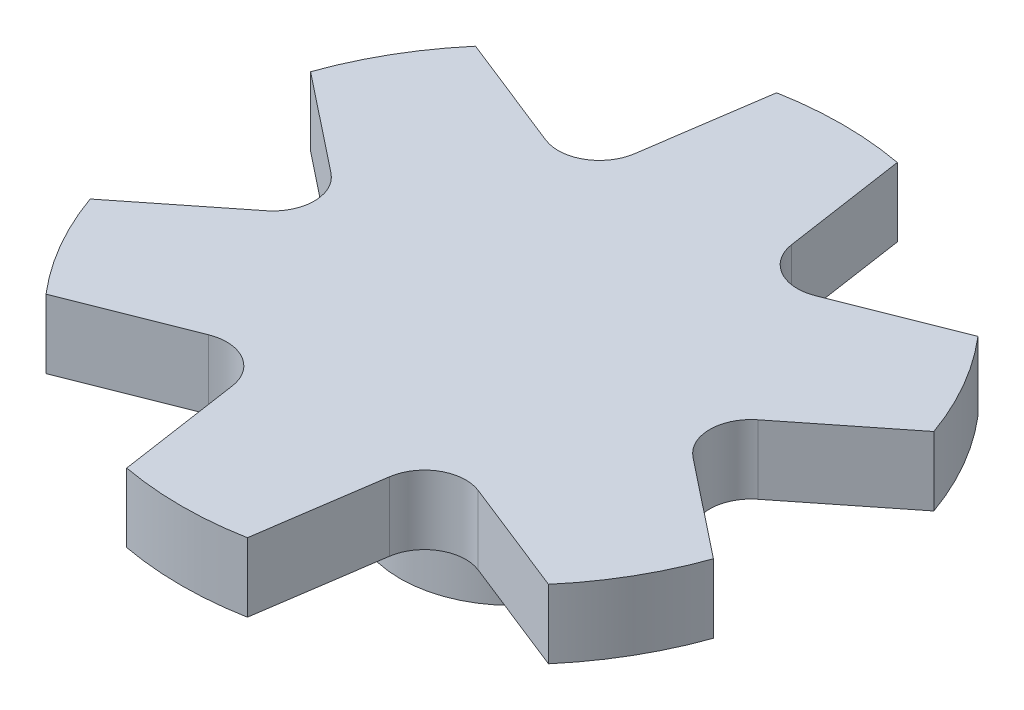
ISO-10303-21;
HEADER;
FILE_DESCRIPTION(('STEP AP214'),'2;1');
FILE_NAME('part.step','',(''),(''),'','','');
FILE_SCHEMA(('AUTOMOTIVE_DESIGN { 1 0 10303 214 1 1 1 1 }'));
ENDSEC;
DATA;
#1=APPLICATION_CONTEXT('core data for automotive mechanical design processes');
#2=APPLICATION_PROTOCOL_DEFINITION('international standard','automotive_design',2000,#1);
#3=PRODUCT_CONTEXT('',#1,'mechanical');
#4=PRODUCT('Part','Part','',(#3));
#5=PRODUCT_RELATED_PRODUCT_CATEGORY('part','',(#4));
#6=PRODUCT_DEFINITION_FORMATION('','',#4);
#7=PRODUCT_DEFINITION_CONTEXT('part definition',#1,'design');
#8=PRODUCT_DEFINITION('design','',#6,#7);
#9=PRODUCT_DEFINITION_SHAPE('','',#8);
#10=(LENGTH_UNIT() NAMED_UNIT(*) SI_UNIT(.MILLI.,.METRE.));
#11=(NAMED_UNIT(*) PLANE_ANGLE_UNIT() SI_UNIT($,.RADIAN.));
#12=(NAMED_UNIT(*) SI_UNIT($,.STERADIAN.) SOLID_ANGLE_UNIT());
#13=UNCERTAINTY_MEASURE_WITH_UNIT(LENGTH_MEASURE(1.E-05),#10,'distance_accuracy_value','');
#14=(GEOMETRIC_REPRESENTATION_CONTEXT(3) GLOBAL_UNCERTAINTY_ASSIGNED_CONTEXT((#13)) GLOBAL_UNIT_ASSIGNED_CONTEXT((#10,
#11,#12)) REPRESENTATION_CONTEXT('',''));
#15=CARTESIAN_POINT('',(0.,0.,0.));
#16=DIRECTION('',(0.,0.,1.));
#17=DIRECTION('',(1.,0.,0.));
#18=AXIS2_PLACEMENT_3D('',#15,#16,#17);
#19=CARTESIAN_POINT('',(-8.67923209555086,0.,4.57966997657877E-13));
#20=DIRECTION('',(0.,1.,0.));
#21=DIRECTION('',(0.,0.,1.));
#22=AXIS2_PLACEMENT_3D('',#19,#20,#21);
#23=PLANE('',#22);
#24=CARTESIAN_POINT('',(0.,0.,0.));
#25=DIRECTION('',(0.,1.,0.));
#26=DIRECTION('',(0.,0.,1.));
#27=AXIS2_PLACEMENT_3D('',#24,#25,#26);
#28=CIRCLE('',#27,4.064);
#29=CARTESIAN_POINT('',(0.,0.,4.064));
#30=VERTEX_POINT('',#29);
#31=EDGE_CURVE('E322',#30,#30,#28,.F.);
#32=ORIENTED_EDGE('',*,*,#31,.F.);
#33=EDGE_LOOP('',(#32));
#34=FACE_BOUND('',#33,.T.);
#35=CARTESIAN_POINT('',(0.,0.,0.));
#36=DIRECTION('',(0.,1.,0.));
#37=DIRECTION('',(0.,0.,1.));
#38=AXIS2_PLACEMENT_3D('',#35,#36,#37);
#39=CIRCLE('',#38,12.);
#40=CARTESIAN_POINT('',(9.1223260997724,0.,7.79635597759693));
#41=VERTEX_POINT('',#40);
#42=CARTESIAN_POINT('',(11.3130053834319,0.,4.00198815520987));
#43=VERTEX_POINT('',#42);
#44=EDGE_CURVE('E211',#41,#43,#39,.T.);
#45=ORIENTED_EDGE('',*,*,#44,.F.);
#46=DIRECTION('',(0.929806378211595,0.,0.368049044336534));
#47=VECTOR('',#46,1.);
#48=CARTESIAN_POINT('',(11.340123854113,0.,8.67423589232366));
#49=LINE('',#48,#47);
#50=CARTESIAN_POINT('',(4.89168961428061,0.,6.12172591277074));
#51=VERTEX_POINT('',#50);
#52=EDGE_CURVE('E209',#51,#41,#49,.T.);
#53=ORIENTED_EDGE('',*,*,#52,.F.);
#54=CARTESIAN_POINT('',(4.33961604777575,0.,7.51643548008819));
#55=DIRECTION('',(0.,-1.,0.));
#56=DIRECTION('',(0.,0.,1.));
#57=AXIS2_PLACEMENT_3D('',#54,#55,#56);
#58=CIRCLE('',#57,1.50000000000008);
#59=CARTESIAN_POINT('',(2.85572534832552,0.,7.29719042978003));
#60=VERTEX_POINT('',#59);
#61=EDGE_CURVE('E262',#60,#51,#58,.T.);
#62=ORIENTED_EDGE('',*,*,#61,.F.);
#63=DIRECTION('',(0.146163366871936,0.,-0.989260466300286));
#64=VECTOR('',#63,1.);
#65=CARTESIAN_POINT('',(1.84204671411442,0.,14.1579532858856));
#66=LINE('',#65,#64);
#67=CARTESIAN_POINT('',(2.19067928365965,0.,11.7983441328071));
#68=VERTEX_POINT('',#67);
#69=EDGE_CURVE('E260',#68,#60,#66,.T.);
#70=ORIENTED_EDGE('',*,*,#69,.F.);
#71=CARTESIAN_POINT('',(-2.19067928365932,0.,11.7983441328072));
#72=VERTEX_POINT('',#71);
#73=EDGE_CURVE('E373',#72,#68,#39,.T.);
#74=ORIENTED_EDGE('',*,*,#73,.F.);
#75=DIRECTION('',(0.146163366871806,0.,0.989260466300306));
#76=VECTOR('',#75,1.);
#77=CARTESIAN_POINT('',(-1.84204671411442,0.,14.1579532858856));
#78=LINE('',#77,#76);
#79=CARTESIAN_POINT('',(-2.85572534832447,0.,7.29719042978077));
#80=VERTEX_POINT('',#79);
#81=EDGE_CURVE('E257',#80,#72,#78,.T.);
#82=ORIENTED_EDGE('',*,*,#81,.F.);
#83=CARTESIAN_POINT('',(-4.33961604777496,0.,7.51643548008855));
#84=DIRECTION('',(0.,-1.,0.));
#85=DIRECTION('',(0.,0.,1.));
#86=AXIS2_PLACEMENT_3D('',#83,#84,#85);
#87=CIRCLE('',#86,1.50000000000004);
#88=CARTESIAN_POINT('',(-4.89168961427951,0.,6.121725912771));
#89=VERTEX_POINT('',#88);
#90=EDGE_CURVE('E255',#89,#80,#87,.T.);
#91=ORIENTED_EDGE('',*,*,#90,.F.);
#92=DIRECTION('',(0.929806378211645,0.,-0.368049044336407));
#93=VECTOR('',#92,1.);
#94=CARTESIAN_POINT('',(-11.340123854113,0.,8.67423589232362));
#95=LINE('',#94,#93);
#96=CARTESIAN_POINT('',(-9.12232609977221,0.,7.79635597759714));
#97=VERTEX_POINT('',#96);
#98=EDGE_CURVE('E253',#97,#89,#95,.T.);
#99=ORIENTED_EDGE('',*,*,#98,.F.);
#100=CARTESIAN_POINT('',(-11.3130053834318,0.,4.00198815521023));
#101=VERTEX_POINT('',#100);
#102=EDGE_CURVE('E378',#101,#97,#39,.T.);
#103=ORIENTED_EDGE('',*,*,#102,.F.);
#104=DIRECTION('',(-0.783643011339801,0.,0.621211421963802));
#105=VECTOR('',#104,1.);
#106=CARTESIAN_POINT('',(-13.1821705682276,0.,5.48371739356199));
#107=LINE('',#106,#105);
#108=CARTESIAN_POINT('',(-7.74741496260515,0.,1.17546451701015));
#109=VERTEX_POINT('',#108);
#110=EDGE_CURVE('E249',#109,#101,#107,.T.);
#111=ORIENTED_EDGE('',*,*,#110,.F.);
#112=CARTESIAN_POINT('',(-8.67923209555086,0.,4.57966997657877E-13));
#113=DIRECTION('',(0.,-1.,0.));
#114=DIRECTION('',(0.,0.,1.));
#115=AXIS2_PLACEMENT_3D('',#112,#113,#114);
#116=CIRCLE('',#115,1.5);
#117=CARTESIAN_POINT('',(-7.747414962605,0.,-1.17546451700912));
#118=VERTEX_POINT('',#117);
#119=EDGE_CURVE('E246',#118,#109,#116,.T.);
#120=ORIENTED_EDGE('',*,*,#119,.F.);
#121=DIRECTION('',(0.783643011339723,0.,0.621211421963901));
#122=VECTOR('',#121,1.);
#123=CARTESIAN_POINT('',(-13.1821705682275,0.,-5.48371739356212));
#124=LINE('',#123,#122);
#125=CARTESIAN_POINT('',(-11.3130053834319,0.,-4.00198815521009));
#126=VERTEX_POINT('',#125);
#127=EDGE_CURVE('E286',#126,#118,#124,.T.);
#128=ORIENTED_EDGE('',*,*,#127,.F.);
#129=CARTESIAN_POINT('',(-9.1223260997724,0.,-7.79635597759694));
#130=VERTEX_POINT('',#129);
#131=EDGE_CURVE('E365',#130,#126,#39,.T.);
#132=ORIENTED_EDGE('',*,*,#131,.F.);
#133=DIRECTION('',(-0.929806378211611,0.,-0.368049044336495));
#134=VECTOR('',#133,1.);
#135=CARTESIAN_POINT('',(-11.340123854113,0.,-8.67423589232358));
#136=LINE('',#135,#134);
#137=CARTESIAN_POINT('',(-4.89168961428064,0.,-6.12172591277078));
#138=VERTEX_POINT('',#137);
#139=EDGE_CURVE('E283',#138,#130,#136,.T.);
#140=ORIENTED_EDGE('',*,*,#139,.F.);
#141=CARTESIAN_POINT('',(-4.33961604777579,0.,-7.51643548008819));
#142=DIRECTION('',(0.,-1.,0.));
#143=DIRECTION('',(0.,0.,1.));
#144=AXIS2_PLACEMENT_3D('',#141,#142,#143);
#145=CIRCLE('',#144,1.50000000000002);
#146=CARTESIAN_POINT('',(-2.85572534832542,0.,-7.29719042978022));
#147=VERTEX_POINT('',#146);
#148=EDGE_CURVE('E281',#147,#138,#145,.T.);
#149=ORIENTED_EDGE('',*,*,#148,.F.);
#150=DIRECTION('',(-0.146163366871941,0.,0.989260466300286));
#151=VECTOR('',#150,1.);
#152=CARTESIAN_POINT('',(-1.84204671411432,0.,-14.1579532858856));
#153=LINE('',#152,#151);
#154=CARTESIAN_POINT('',(-2.19067928365956,0.,-11.7983441328072));
#155=VERTEX_POINT('',#154);
#156=EDGE_CURVE('E279',#155,#147,#153,.T.);
#157=ORIENTED_EDGE('',*,*,#156,.F.);
#158=CARTESIAN_POINT('',(2.19067928365941,0.,-11.7983441328072));
#159=VERTEX_POINT('',#158);
#160=EDGE_CURVE('E360',#159,#155,#39,.T.);
#161=ORIENTED_EDGE('',*,*,#160,.F.);
#162=DIRECTION('',(-0.146163366871801,0.,-0.989260466300306));
#163=VECTOR('',#162,1.);
#164=CARTESIAN_POINT('',(1.84204671411451,0.,-14.1579532858856));
#165=LINE('',#164,#163);
#166=CARTESIAN_POINT('',(2.85572534832459,0.,-7.297190429781));
#167=VERTEX_POINT('',#166);
#168=EDGE_CURVE('E276',#167,#159,#165,.T.);
#169=ORIENTED_EDGE('',*,*,#168,.F.);
#170=CARTESIAN_POINT('',(4.33961604777507,0.,-7.51643548008866));
#171=DIRECTION('',(0.,-1.,0.));
#172=DIRECTION('',(0.,0.,1.));
#173=AXIS2_PLACEMENT_3D('',#170,#171,#172);
#174=CIRCLE('',#173,1.50000000000001);
#175=CARTESIAN_POINT('',(4.89168961427954,0.,-6.12172591277121));
#176=VERTEX_POINT('',#175);
#177=EDGE_CURVE('E274',#176,#167,#174,.T.);
#178=ORIENTED_EDGE('',*,*,#177,.F.);
#179=DIRECTION('',(-0.929806378211664,0.,0.368049044336361));
#180=VECTOR('',#179,1.);
#181=CARTESIAN_POINT('',(11.3401238541132,0.,-8.67423589232349));
#182=LINE('',#181,#180);
#183=CARTESIAN_POINT('',(9.12232609977225,0.,-7.79635597759711));
#184=VERTEX_POINT('',#183);
#185=EDGE_CURVE('E272',#184,#176,#182,.T.);
#186=ORIENTED_EDGE('',*,*,#185,.F.);
#187=CARTESIAN_POINT('',(11.3130053834318,0.,-4.00198815521022));
#188=VERTEX_POINT('',#187);
#189=EDGE_CURVE('E362',#188,#184,#39,.T.);
#190=ORIENTED_EDGE('',*,*,#189,.F.);
#191=DIRECTION('',(0.783643011339806,0.,-0.621211421963796));
#192=VECTOR('',#191,1.);
#193=CARTESIAN_POINT('',(13.1821705682275,0.,-5.48371739356193));
#194=LINE('',#193,#192);
#195=CARTESIAN_POINT('',(7.74741496260534,0.,-1.17546451701017));
#196=VERTEX_POINT('',#195);
#197=EDGE_CURVE('E269',#196,#188,#194,.T.);
#198=ORIENTED_EDGE('',*,*,#197,.F.);
#199=CARTESIAN_POINT('',(8.67923209555104,0.,-4.3269875418577E-13));
#200=DIRECTION('',(0.,-1.,0.));
#201=DIRECTION('',(0.,0.,1.));
#202=AXIS2_PLACEMENT_3D('',#199,#200,#201);
#203=CIRCLE('',#202,1.50000000000003);
#204=CARTESIAN_POINT('',(7.74741496260504,0.,1.17546451700891));
#205=VERTEX_POINT('',#204);
#206=EDGE_CURVE('E267',#205,#196,#203,.T.);
#207=ORIENTED_EDGE('',*,*,#206,.F.);
#208=DIRECTION('',(-0.783643011339728,0.,-0.621211421963894));
#209=VECTOR('',#208,1.);
#210=CARTESIAN_POINT('',(13.1821705682275,0.,5.48371739356183));
#211=LINE('',#210,#209);
#212=EDGE_CURVE('E265',#43,#205,#211,.T.);
#213=ORIENTED_EDGE('',*,*,#212,.F.);
#214=EDGE_LOOP('',(#45,#53,#62,#70,#74,#82,#91,#99,#103,#111,#120,#128,#132,#140,#149,#157,#161,
#169,#178,#186,#190,#198,#207,#213));
#215=FACE_BOUND('',#214,.T.);
#216=ADVANCED_FACE('F33',(#34,#215),#23,.F.);
#217=CARTESIAN_POINT('',(-13.1821705682276,2.5,5.48371739356199));
#218=DIRECTION('',(0.621211421963802,0.,0.783643011339801));
#219=DIRECTION('',(0.783643011339801,0.,-0.621211421963802));
#220=AXIS2_PLACEMENT_3D('',#217,#218,#219);
#221=PLANE('',#220);
#222=DIRECTION('',(0.,1.,0.));
#223=VECTOR('',#222,1.);
#224=CARTESIAN_POINT('',(-11.3130053834318,-3.75,4.00198815521023));
#225=LINE('',#224,#223);
#226=CARTESIAN_POINT('',(-11.3130053834318,2.5,4.00198815521023));
#227=VERTEX_POINT('',#226);
#228=EDGE_CURVE('E379',#227,#101,#225,.F.);
#229=ORIENTED_EDGE('',*,*,#228,.F.);
#230=DIRECTION('',(-0.783643011339801,0.,0.621211421963802));
#231=VECTOR('',#230,1.);
#232=CARTESIAN_POINT('',(-13.1821705682276,2.5,5.48371739356199));
#233=LINE('',#232,#231);
#234=CARTESIAN_POINT('',(-7.74741496260515,2.5,1.17546451701015));
#235=VERTEX_POINT('',#234);
#236=EDGE_CURVE('E391',#235,#227,#233,.T.);
#237=ORIENTED_EDGE('',*,*,#236,.F.);
#238=DIRECTION('',(0.,-1.,0.));
#239=VECTOR('',#238,1.);
#240=CARTESIAN_POINT('',(-7.74741496260515,2.5,1.17546451701015));
#241=LINE('',#240,#239);
#242=EDGE_CURVE('E320',#235,#109,#241,.T.);
#243=ORIENTED_EDGE('',*,*,#242,.T.);
#244=ORIENTED_EDGE('',*,*,#110,.T.);
#245=EDGE_LOOP('',(#229,#237,#243,#244));
#246=FACE_BOUND('',#245,.T.);
#247=ADVANCED_FACE('F445',(#246),#221,.F.);
#248=CARTESIAN_POINT('',(-11.340123854113,2.5,8.67423589232362));
#249=DIRECTION('',(-0.368049044336407,0.,-0.929806378211645));
#250=DIRECTION('',(-0.929806378211645,0.,0.368049044336407));
#251=AXIS2_PLACEMENT_3D('',#248,#249,#250);
#252=PLANE('',#251);
#253=DIRECTION('',(0.,1.,0.));
#254=VECTOR('',#253,1.);
#255=CARTESIAN_POINT('',(-9.12232609977221,-3.75,7.79635597759714));
#256=LINE('',#255,#254);
#257=CARTESIAN_POINT('',(-9.12232609977221,2.5,7.79635597759714));
#258=VERTEX_POINT('',#257);
#259=EDGE_CURVE('E376',#97,#258,#256,.T.);
#260=ORIENTED_EDGE('',*,*,#259,.F.);
#261=ORIENTED_EDGE('',*,*,#98,.T.);
#262=DIRECTION('',(0.,-1.,0.));
#263=VECTOR('',#262,1.);
#264=CARTESIAN_POINT('',(-4.89168961427951,2.5,6.121725912771));
#265=LINE('',#264,#263);
#266=CARTESIAN_POINT('',(-4.89168961427951,2.5,6.121725912771));
#267=VERTEX_POINT('',#266);
#268=EDGE_CURVE('E317',#267,#89,#265,.T.);
#269=ORIENTED_EDGE('',*,*,#268,.F.);
#270=DIRECTION('',(0.929806378211645,0.,-0.368049044336407));
#271=VECTOR('',#270,1.);
#272=CARTESIAN_POINT('',(-11.340123854113,2.5,8.67423589232362));
#273=LINE('',#272,#271);
#274=EDGE_CURVE('E393',#258,#267,#273,.T.);
#275=ORIENTED_EDGE('',*,*,#274,.F.);
#276=EDGE_LOOP('',(#260,#261,#269,#275));
#277=FACE_BOUND('',#276,.T.);
#278=ADVANCED_FACE('F453',(#277),#252,.F.);
#279=CARTESIAN_POINT('',(-1.84204671411442,2.5,14.1579532858856));
#280=DIRECTION('',(0.989260466300306,0.,-0.146163366871806));
#281=DIRECTION('',(-0.146163366871806,0.,-0.989260466300306));
#282=AXIS2_PLACEMENT_3D('',#279,#280,#281);
#283=PLANE('',#282);
#284=DIRECTION('',(0.,1.,0.));
#285=VECTOR('',#284,1.);
#286=CARTESIAN_POINT('',(-2.19067928365932,-3.75,11.7983441328072));
#287=LINE('',#286,#285);
#288=CARTESIAN_POINT('',(-2.19067928365932,2.5,11.7983441328072));
#289=VERTEX_POINT('',#288);
#290=EDGE_CURVE('E374',#289,#72,#287,.F.);
#291=ORIENTED_EDGE('',*,*,#290,.F.);
#292=DIRECTION('',(0.146163366871806,0.,0.989260466300306));
#293=VECTOR('',#292,1.);
#294=CARTESIAN_POINT('',(-1.84204671411442,2.5,14.1579532858856));
#295=LINE('',#294,#293);
#296=CARTESIAN_POINT('',(-2.85572534832447,2.5,7.29719042978077));
#297=VERTEX_POINT('',#296);
#298=EDGE_CURVE('E397',#297,#289,#295,.T.);
#299=ORIENTED_EDGE('',*,*,#298,.F.);
#300=DIRECTION('',(0.,-1.,0.));
#301=VECTOR('',#300,1.);
#302=CARTESIAN_POINT('',(-2.85572534832447,2.5,7.29719042978077));
#303=LINE('',#302,#301);
#304=EDGE_CURVE('E314',#297,#80,#303,.T.);
#305=ORIENTED_EDGE('',*,*,#304,.T.);
#306=ORIENTED_EDGE('',*,*,#81,.T.);
#307=EDGE_LOOP('',(#291,#299,#305,#306));
#308=FACE_BOUND('',#307,.T.);
#309=ADVANCED_FACE('F519',(#308),#283,.F.);
#310=CARTESIAN_POINT('',(1.84204671411442,2.5,14.1579532858856));
#311=DIRECTION('',(-0.989260466300286,0.,-0.146163366871936));
#312=DIRECTION('',(-0.146163366871936,0.,0.989260466300286));
#313=AXIS2_PLACEMENT_3D('',#310,#311,#312);
#314=PLANE('',#313);
#315=DIRECTION('',(0.,1.,0.));
#316=VECTOR('',#315,1.);
#317=CARTESIAN_POINT('',(2.19067928365965,-3.75,11.7983441328071));
#318=LINE('',#317,#316);
#319=CARTESIAN_POINT('',(2.19067928365965,2.5,11.7983441328071));
#320=VERTEX_POINT('',#319);
#321=EDGE_CURVE('E210',#68,#320,#318,.T.);
#322=ORIENTED_EDGE('',*,*,#321,.F.);
#323=ORIENTED_EDGE('',*,*,#69,.T.);
#324=DIRECTION('',(0.,-1.,0.));
#325=VECTOR('',#324,1.);
#326=CARTESIAN_POINT('',(2.85572534832552,2.5,7.29719042978003));
#327=LINE('',#326,#325);
#328=CARTESIAN_POINT('',(2.85572534832552,2.5,7.29719042978003));
#329=VERTEX_POINT('',#328);
#330=EDGE_CURVE('E311',#329,#60,#327,.T.);
#331=ORIENTED_EDGE('',*,*,#330,.F.);
#332=DIRECTION('',(0.146163366871936,0.,-0.989260466300286));
#333=VECTOR('',#332,1.);
#334=CARTESIAN_POINT('',(1.84204671411442,2.5,14.1579532858856));
#335=LINE('',#334,#333);
#336=EDGE_CURVE('E221',#320,#329,#335,.T.);
#337=ORIENTED_EDGE('',*,*,#336,.F.);
#338=EDGE_LOOP('',(#322,#323,#331,#337));
#339=FACE_BOUND('',#338,.T.);
#340=ADVANCED_FACE('F401',(#339),#314,.F.);
#341=CARTESIAN_POINT('',(11.340123854113,2.5,8.67423589232366));
#342=DIRECTION('',(0.368049044336534,0.,-0.929806378211595));
#343=DIRECTION('',(-0.929806378211595,0.,-0.368049044336534));
#344=AXIS2_PLACEMENT_3D('',#341,#342,#343);
#345=PLANE('',#344);
#346=DIRECTION('',(0.,1.,0.));
#347=VECTOR('',#346,1.);
#348=CARTESIAN_POINT('',(9.1223260997724,-3.75,7.79635597759693));
#349=LINE('',#348,#347);
#350=CARTESIAN_POINT('',(9.12232609977239,2.5,7.79635597759693));
#351=VERTEX_POINT('',#350);
#352=EDGE_CURVE('E195',#351,#41,#349,.F.);
#353=ORIENTED_EDGE('',*,*,#352,.F.);
#354=DIRECTION('',(0.929806378211595,0.,0.368049044336534));
#355=VECTOR('',#354,1.);
#356=CARTESIAN_POINT('',(11.340123854113,2.5,8.67423589232366));
#357=LINE('',#356,#355);
#358=CARTESIAN_POINT('',(4.89168961428061,2.5,6.12172591277074));
#359=VERTEX_POINT('',#358);
#360=EDGE_CURVE('E207',#359,#351,#357,.T.);
#361=ORIENTED_EDGE('',*,*,#360,.F.);
#362=DIRECTION('',(0.,-1.,0.));
#363=VECTOR('',#362,1.);
#364=CARTESIAN_POINT('',(4.89168961428061,2.5,6.12172591277074));
#365=LINE('',#364,#363);
#366=EDGE_CURVE('E309',#359,#51,#365,.T.);
#367=ORIENTED_EDGE('',*,*,#366,.T.);
#368=ORIENTED_EDGE('',*,*,#52,.T.);
#369=EDGE_LOOP('',(#353,#361,#367,#368));
#370=FACE_BOUND('',#369,.T.);
#371=ADVANCED_FACE('F205',(#370),#345,.F.);
#372=CARTESIAN_POINT('',(13.1821705682275,2.5,5.48371739356183));
#373=DIRECTION('',(-0.621211421963894,0.,0.783643011339728));
#374=DIRECTION('',(0.783643011339728,0.,0.621211421963894));
#375=AXIS2_PLACEMENT_3D('',#372,#373,#374);
#376=PLANE('',#375);
#377=DIRECTION('',(0.,1.,0.));
#378=VECTOR('',#377,1.);
#379=CARTESIAN_POINT('',(11.3130053834319,-3.75,4.00198815520987));
#380=LINE('',#379,#378);
#381=CARTESIAN_POINT('',(11.3130053834319,2.5,4.00198815520986));
#382=VERTEX_POINT('',#381);
#383=EDGE_CURVE('E198',#43,#382,#380,.T.);
#384=ORIENTED_EDGE('',*,*,#383,.F.);
#385=ORIENTED_EDGE('',*,*,#212,.T.);
#386=DIRECTION('',(0.,-1.,0.));
#387=VECTOR('',#386,1.);
#388=CARTESIAN_POINT('',(7.74741496260504,2.5,1.17546451700891));
#389=LINE('',#388,#387);
#390=CARTESIAN_POINT('',(7.74741496260504,2.5,1.17546451700891));
#391=VERTEX_POINT('',#390);
#392=EDGE_CURVE('E306',#391,#205,#389,.T.);
#393=ORIENTED_EDGE('',*,*,#392,.F.);
#394=DIRECTION('',(-0.783643011339728,0.,-0.621211421963894));
#395=VECTOR('',#394,1.);
#396=CARTESIAN_POINT('',(13.1821705682275,2.5,5.48371739356183));
#397=LINE('',#396,#395);
#398=EDGE_CURVE('E217',#382,#391,#397,.T.);
#399=ORIENTED_EDGE('',*,*,#398,.F.);
#400=EDGE_LOOP('',(#384,#385,#393,#399));
#401=FACE_BOUND('',#400,.T.);
#402=ADVANCED_FACE('F507',(#401),#376,.F.);
#403=CARTESIAN_POINT('',(13.1821705682275,2.5,-5.48371739356193));
#404=DIRECTION('',(-0.621211421963796,0.,-0.783643011339806));
#405=DIRECTION('',(-0.783643011339806,0.,0.621211421963796));
#406=AXIS2_PLACEMENT_3D('',#403,#404,#405);
#407=PLANE('',#406);
#408=DIRECTION('',(0.,1.,0.));
#409=VECTOR('',#408,1.);
#410=CARTESIAN_POINT('',(11.3130053834318,-3.75,-4.00198815521022));
#411=LINE('',#410,#409);
#412=CARTESIAN_POINT('',(11.3130053834318,2.5,-4.00198815521022));
#413=VERTEX_POINT('',#412);
#414=EDGE_CURVE('E369',#413,#188,#411,.F.);
#415=ORIENTED_EDGE('',*,*,#414,.F.);
#416=DIRECTION('',(0.783643011339806,0.,-0.621211421963796));
#417=VECTOR('',#416,1.);
#418=CARTESIAN_POINT('',(13.1821705682275,2.5,-5.48371739356193));
#419=LINE('',#418,#417);
#420=CARTESIAN_POINT('',(7.74741496260534,2.5,-1.17546451701017));
#421=VERTEX_POINT('',#420);
#422=EDGE_CURVE('E226',#421,#413,#419,.T.);
#423=ORIENTED_EDGE('',*,*,#422,.F.);
#424=DIRECTION('',(0.,-1.,0.));
#425=VECTOR('',#424,1.);
#426=CARTESIAN_POINT('',(7.74741496260534,2.5,-1.17546451701017));
#427=LINE('',#426,#425);
#428=EDGE_CURVE('E303',#421,#196,#427,.T.);
#429=ORIENTED_EDGE('',*,*,#428,.T.);
#430=ORIENTED_EDGE('',*,*,#197,.T.);
#431=EDGE_LOOP('',(#415,#423,#429,#430));
#432=FACE_BOUND('',#431,.T.);
#433=ADVANCED_FACE('F505',(#432),#407,.F.);
#434=CARTESIAN_POINT('',(11.3401238541132,2.5,-8.67423589232349));
#435=DIRECTION('',(0.368049044336361,0.,0.929806378211664));
#436=DIRECTION('',(0.929806378211664,0.,-0.368049044336361));
#437=AXIS2_PLACEMENT_3D('',#434,#435,#436);
#438=PLANE('',#437);
#439=DIRECTION('',(0.,1.,0.));
#440=VECTOR('',#439,1.);
#441=CARTESIAN_POINT('',(9.12232609977225,-3.75,-7.79635597759711));
#442=LINE('',#441,#440);
#443=CARTESIAN_POINT('',(9.12232609977225,2.5,-7.79635597759711));
#444=VERTEX_POINT('',#443);
#445=EDGE_CURVE('E346',#184,#444,#442,.T.);
#446=ORIENTED_EDGE('',*,*,#445,.F.);
#447=ORIENTED_EDGE('',*,*,#185,.T.);
#448=DIRECTION('',(0.,-1.,0.));
#449=VECTOR('',#448,1.);
#450=CARTESIAN_POINT('',(4.89168961427954,2.5,-6.12172591277121));
#451=LINE('',#450,#449);
#452=CARTESIAN_POINT('',(4.89168961427954,2.5,-6.12172591277121));
#453=VERTEX_POINT('',#452);
#454=EDGE_CURVE('E300',#453,#176,#451,.T.);
#455=ORIENTED_EDGE('',*,*,#454,.F.);
#456=DIRECTION('',(-0.929806378211664,0.,0.368049044336361));
#457=VECTOR('',#456,1.);
#458=CARTESIAN_POINT('',(11.3401238541132,2.5,-8.67423589232349));
#459=LINE('',#458,#457);
#460=EDGE_CURVE('E229',#444,#453,#459,.T.);
#461=ORIENTED_EDGE('',*,*,#460,.F.);
#462=EDGE_LOOP('',(#446,#447,#455,#461));
#463=FACE_BOUND('',#462,.T.);
#464=ADVANCED_FACE('F345',(#463),#438,.F.);
#465=CARTESIAN_POINT('',(1.84204671411451,2.5,-14.1579532858856));
#466=DIRECTION('',(-0.989260466300306,0.,0.146163366871801));
#467=DIRECTION('',(0.146163366871801,0.,0.989260466300306));
#468=AXIS2_PLACEMENT_3D('',#465,#466,#467);
#469=PLANE('',#468);
#470=DIRECTION('',(0.,1.,0.));
#471=VECTOR('',#470,1.);
#472=CARTESIAN_POINT('',(2.19067928365941,-3.75,-11.7983441328072));
#473=LINE('',#472,#471);
#474=CARTESIAN_POINT('',(2.19067928365941,2.5,-11.7983441328072));
#475=VERTEX_POINT('',#474);
#476=EDGE_CURVE('E358',#475,#159,#473,.F.);
#477=ORIENTED_EDGE('',*,*,#476,.F.);
#478=DIRECTION('',(-0.146163366871801,0.,-0.989260466300306));
#479=VECTOR('',#478,1.);
#480=CARTESIAN_POINT('',(1.84204671411451,2.5,-14.1579532858856));
#481=LINE('',#480,#479);
#482=CARTESIAN_POINT('',(2.85572534832459,2.5,-7.297190429781));
#483=VERTEX_POINT('',#482);
#484=EDGE_CURVE('E233',#483,#475,#481,.T.);
#485=ORIENTED_EDGE('',*,*,#484,.F.);
#486=DIRECTION('',(0.,-1.,0.));
#487=VECTOR('',#486,1.);
#488=CARTESIAN_POINT('',(2.85572534832459,2.5,-7.297190429781));
#489=LINE('',#488,#487);
#490=EDGE_CURVE('E297',#483,#167,#489,.T.);
#491=ORIENTED_EDGE('',*,*,#490,.T.);
#492=ORIENTED_EDGE('',*,*,#168,.T.);
#493=EDGE_LOOP('',(#477,#485,#491,#492));
#494=FACE_BOUND('',#493,.T.);
#495=ADVANCED_FACE('F356',(#494),#469,.F.);
#496=CARTESIAN_POINT('',(-1.84204671411432,2.5,-14.1579532858856));
#497=DIRECTION('',(0.989260466300286,0.,0.146163366871941));
#498=DIRECTION('',(0.146163366871941,0.,-0.989260466300286));
#499=AXIS2_PLACEMENT_3D('',#496,#497,#498);
#500=PLANE('',#499);
#501=DIRECTION('',(0.,1.,0.));
#502=VECTOR('',#501,1.);
#503=CARTESIAN_POINT('',(-2.19067928365956,-3.75,-11.7983441328072));
#504=LINE('',#503,#502);
#505=CARTESIAN_POINT('',(-2.19067928365956,2.5,-11.7983441328072));
#506=VERTEX_POINT('',#505);
#507=EDGE_CURVE('E57',#155,#506,#504,.T.);
#508=ORIENTED_EDGE('',*,*,#507,.F.);
#509=ORIENTED_EDGE('',*,*,#156,.T.);
#510=DIRECTION('',(0.,-1.,0.));
#511=VECTOR('',#510,1.);
#512=CARTESIAN_POINT('',(-2.85572534832542,2.5,-7.29719042978022));
#513=LINE('',#512,#511);
#514=CARTESIAN_POINT('',(-2.85572534832542,2.5,-7.29719042978022));
#515=VERTEX_POINT('',#514);
#516=EDGE_CURVE('E294',#515,#147,#513,.T.);
#517=ORIENTED_EDGE('',*,*,#516,.F.);
#518=DIRECTION('',(-0.146163366871941,0.,0.989260466300286));
#519=VECTOR('',#518,1.);
#520=CARTESIAN_POINT('',(-1.84204671411432,2.5,-14.1579532858856));
#521=LINE('',#520,#519);
#522=EDGE_CURVE('E236',#506,#515,#521,.T.);
#523=ORIENTED_EDGE('',*,*,#522,.F.);
#524=EDGE_LOOP('',(#508,#509,#517,#523));
#525=FACE_BOUND('',#524,.T.);
#526=ADVANCED_FACE('F433',(#525),#500,.F.);
#527=CARTESIAN_POINT('',(-11.340123854113,2.5,-8.67423589232358));
#528=DIRECTION('',(-0.368049044336495,0.,0.929806378211611));
#529=DIRECTION('',(0.929806378211611,0.,0.368049044336495));
#530=AXIS2_PLACEMENT_3D('',#527,#528,#529);
#531=PLANE('',#530);
#532=DIRECTION('',(0.,1.,0.));
#533=VECTOR('',#532,1.);
#534=CARTESIAN_POINT('',(-9.1223260997724,-3.75,-7.79635597759694));
#535=LINE('',#534,#533);
#536=CARTESIAN_POINT('',(-9.12232609977239,2.5,-7.79635597759693));
#537=VERTEX_POINT('',#536);
#538=EDGE_CURVE('E415',#537,#130,#535,.F.);
#539=ORIENTED_EDGE('',*,*,#538,.F.);
#540=DIRECTION('',(-0.929806378211611,0.,-0.368049044336495));
#541=VECTOR('',#540,1.);
#542=CARTESIAN_POINT('',(-11.340123854113,2.5,-8.67423589232358));
#543=LINE('',#542,#541);
#544=CARTESIAN_POINT('',(-4.89168961428064,2.5,-6.12172591277078));
#545=VERTEX_POINT('',#544);
#546=EDGE_CURVE('E240',#545,#537,#543,.T.);
#547=ORIENTED_EDGE('',*,*,#546,.F.);
#548=DIRECTION('',(0.,-1.,0.));
#549=VECTOR('',#548,1.);
#550=CARTESIAN_POINT('',(-4.89168961428064,2.5,-6.12172591277078));
#551=LINE('',#550,#549);
#552=EDGE_CURVE('E291',#545,#138,#551,.T.);
#553=ORIENTED_EDGE('',*,*,#552,.T.);
#554=ORIENTED_EDGE('',*,*,#139,.T.);
#555=EDGE_LOOP('',(#539,#547,#553,#554));
#556=FACE_BOUND('',#555,.T.);
#557=ADVANCED_FACE('F425',(#556),#531,.F.);
#558=CARTESIAN_POINT('',(-13.1821705682275,2.5,-5.48371739356212));
#559=DIRECTION('',(0.621211421963901,0.,-0.783643011339722));
#560=DIRECTION('',(-0.783643011339722,0.,-0.621211421963901));
#561=AXIS2_PLACEMENT_3D('',#558,#559,#560);
#562=PLANE('',#561);
#563=DIRECTION('',(0.,1.,0.));
#564=VECTOR('',#563,1.);
#565=CARTESIAN_POINT('',(-11.3130053834319,-3.75,-4.00198815521009));
#566=LINE('',#565,#564);
#567=CARTESIAN_POINT('',(-11.3130053834319,2.5,-4.00198815521009));
#568=VERTEX_POINT('',#567);
#569=EDGE_CURVE('E49',#126,#568,#566,.T.);
#570=ORIENTED_EDGE('',*,*,#569,.F.);
#571=ORIENTED_EDGE('',*,*,#127,.T.);
#572=DIRECTION('',(0.,-1.,0.));
#573=VECTOR('',#572,1.);
#574=CARTESIAN_POINT('',(-7.747414962605,2.5,-1.17546451700912));
#575=LINE('',#574,#573);
#576=CARTESIAN_POINT('',(-7.747414962605,2.5,-1.17546451700912));
#577=VERTEX_POINT('',#576);
#578=EDGE_CURVE('E245',#577,#118,#575,.T.);
#579=ORIENTED_EDGE('',*,*,#578,.F.);
#580=DIRECTION('',(0.783643011339723,0.,0.621211421963901));
#581=VECTOR('',#580,1.);
#582=CARTESIAN_POINT('',(-13.1821705682275,2.5,-5.48371739356212));
#583=LINE('',#582,#581);
#584=EDGE_CURVE('E243',#568,#577,#583,.T.);
#585=ORIENTED_EDGE('',*,*,#584,.F.);
#586=EDGE_LOOP('',(#570,#571,#579,#585));
#587=FACE_BOUND('',#586,.T.);
#588=ADVANCED_FACE('F440',(#587),#562,.F.);
#589=CARTESIAN_POINT('',(-8.67923209555086,2.5,4.57966997657877E-13));
#590=DIRECTION('',(0.,1.,0.));
#591=DIRECTION('',(0.,0.,1.));
#592=AXIS2_PLACEMENT_3D('',#589,#590,#591);
#593=PLANE('',#592);
#594=ORIENTED_EDGE('',*,*,#360,.T.);
#595=CARTESIAN_POINT('',(0.,2.5,0.));
#596=DIRECTION('',(0.,1.,0.));
#597=DIRECTION('',(0.,0.,1.));
#598=AXIS2_PLACEMENT_3D('',#595,#596,#597);
#599=CIRCLE('',#598,12.);
#600=EDGE_CURVE('E11',#351,#382,#599,.T.);
#601=ORIENTED_EDGE('',*,*,#600,.T.);
#602=ORIENTED_EDGE('',*,*,#398,.T.);
#603=CARTESIAN_POINT('',(8.67923209555104,2.5,-4.3269875418577E-13));
#604=DIRECTION('',(0.,-1.,0.));
#605=DIRECTION('',(0.,0.,1.));
#606=AXIS2_PLACEMENT_3D('',#603,#604,#605);
#607=CIRCLE('',#606,1.50000000000003);
#608=EDGE_CURVE('E219',#391,#421,#607,.T.);
#609=ORIENTED_EDGE('',*,*,#608,.T.);
#610=ORIENTED_EDGE('',*,*,#422,.T.);
#611=EDGE_CURVE('E42',#413,#444,#599,.T.);
#612=ORIENTED_EDGE('',*,*,#611,.T.);
#613=ORIENTED_EDGE('',*,*,#460,.T.);
#614=CARTESIAN_POINT('',(4.33961604777507,2.5,-7.51643548008866));
#615=DIRECTION('',(0.,-1.,0.));
#616=DIRECTION('',(0.,0.,1.));
#617=AXIS2_PLACEMENT_3D('',#614,#615,#616);
#618=CIRCLE('',#617,1.50000000000001);
#619=EDGE_CURVE('E231',#453,#483,#618,.T.);
#620=ORIENTED_EDGE('',*,*,#619,.T.);
#621=ORIENTED_EDGE('',*,*,#484,.T.);
#622=EDGE_CURVE('E334',#475,#506,#599,.T.);
#623=ORIENTED_EDGE('',*,*,#622,.T.);
#624=ORIENTED_EDGE('',*,*,#522,.T.);
#625=CARTESIAN_POINT('',(-4.33961604777579,2.5,-7.51643548008819));
#626=DIRECTION('',(0.,-1.,0.));
#627=DIRECTION('',(0.,0.,1.));
#628=AXIS2_PLACEMENT_3D('',#625,#626,#627);
#629=CIRCLE('',#628,1.50000000000002);
#630=EDGE_CURVE('E238',#515,#545,#629,.T.);
#631=ORIENTED_EDGE('',*,*,#630,.T.);
#632=ORIENTED_EDGE('',*,*,#546,.T.);
#633=EDGE_CURVE('E331',#537,#568,#599,.T.);
#634=ORIENTED_EDGE('',*,*,#633,.T.);
#635=ORIENTED_EDGE('',*,*,#584,.T.);
#636=CARTESIAN_POINT('',(-8.67923209555086,2.5,4.57966997657877E-13));
#637=DIRECTION('',(0.,-1.,0.));
#638=DIRECTION('',(0.,0.,1.));
#639=AXIS2_PLACEMENT_3D('',#636,#637,#638);
#640=CIRCLE('',#639,1.5);
#641=EDGE_CURVE('E288',#577,#235,#640,.T.);
#642=ORIENTED_EDGE('',*,*,#641,.T.);
#643=ORIENTED_EDGE('',*,*,#236,.T.);
#644=EDGE_CURVE('E327',#227,#258,#599,.T.);
#645=ORIENTED_EDGE('',*,*,#644,.T.);
#646=ORIENTED_EDGE('',*,*,#274,.T.);
#647=CARTESIAN_POINT('',(-4.33961604777496,2.5,7.51643548008855));
#648=DIRECTION('',(0.,-1.,0.));
#649=DIRECTION('',(0.,0.,1.));
#650=AXIS2_PLACEMENT_3D('',#647,#648,#649);
#651=CIRCLE('',#650,1.50000000000004);
#652=EDGE_CURVE('E395',#267,#297,#651,.T.);
#653=ORIENTED_EDGE('',*,*,#652,.T.);
#654=ORIENTED_EDGE('',*,*,#298,.T.);
#655=EDGE_CURVE('E37',#289,#320,#599,.T.);
#656=ORIENTED_EDGE('',*,*,#655,.T.);
#657=ORIENTED_EDGE('',*,*,#336,.T.);
#658=CARTESIAN_POINT('',(4.33961604777575,2.5,7.51643548008819));
#659=DIRECTION('',(0.,-1.,0.));
#660=DIRECTION('',(0.,0.,1.));
#661=AXIS2_PLACEMENT_3D('',#658,#659,#660);
#662=CIRCLE('',#661,1.50000000000008);
#663=EDGE_CURVE('E215',#329,#359,#662,.T.);
#664=ORIENTED_EDGE('',*,*,#663,.T.);
#665=EDGE_LOOP('',(#594,#601,#602,#609,#610,#612,#613,#620,#621,#623,#624,#631,#632,#634,#635,
#642,#643,#645,#646,#653,#654,#656,#657,#664));
#666=FACE_BOUND('',#665,.T.);
#667=ADVANCED_FACE('F213',(#666),#593,.T.);
#668=CARTESIAN_POINT('',(-8.67923209555086,2.5,4.57966997657877E-13));
#669=DIRECTION('',(0.,-1.,0.));
#670=DIRECTION('',(0.,0.,-1.));
#671=AXIS2_PLACEMENT_3D('',#668,#669,#670);
#672=CYLINDRICAL_SURFACE('',#671,1.5);
#673=ORIENTED_EDGE('',*,*,#119,.T.);
#674=ORIENTED_EDGE('',*,*,#242,.F.);
#675=ORIENTED_EDGE('',*,*,#641,.F.);
#676=ORIENTED_EDGE('',*,*,#578,.T.);
#677=EDGE_LOOP('',(#673,#674,#675,#676));
#678=FACE_BOUND('',#677,.T.);
#679=ADVANCED_FACE('F35',(#678),#672,.F.);
#680=CARTESIAN_POINT('',(-4.33961604777496,2.5,7.51643548008855));
#681=DIRECTION('',(0.,-1.,0.));
#682=DIRECTION('',(0.,0.,-1.));
#683=AXIS2_PLACEMENT_3D('',#680,#681,#682);
#684=CYLINDRICAL_SURFACE('',#683,1.50000000000004);
#685=ORIENTED_EDGE('',*,*,#90,.T.);
#686=ORIENTED_EDGE('',*,*,#304,.F.);
#687=ORIENTED_EDGE('',*,*,#652,.F.);
#688=ORIENTED_EDGE('',*,*,#268,.T.);
#689=EDGE_LOOP('',(#685,#686,#687,#688));
#690=FACE_BOUND('',#689,.T.);
#691=ADVANCED_FACE('F486',(#690),#684,.F.);
#692=CARTESIAN_POINT('',(4.33961604777575,2.5,7.51643548008819));
#693=DIRECTION('',(0.,-1.,0.));
#694=DIRECTION('',(0.,0.,-1.));
#695=AXIS2_PLACEMENT_3D('',#692,#693,#694);
#696=CYLINDRICAL_SURFACE('',#695,1.50000000000008);
#697=ORIENTED_EDGE('',*,*,#61,.T.);
#698=ORIENTED_EDGE('',*,*,#366,.F.);
#699=ORIENTED_EDGE('',*,*,#663,.F.);
#700=ORIENTED_EDGE('',*,*,#330,.T.);
#701=EDGE_LOOP('',(#697,#698,#699,#700));
#702=FACE_BOUND('',#701,.T.);
#703=ADVANCED_FACE('F405',(#702),#696,.F.);
#704=CARTESIAN_POINT('',(8.67923209555104,2.5,-4.3269875418577E-13));
#705=DIRECTION('',(0.,-1.,0.));
#706=DIRECTION('',(0.,0.,-1.));
#707=AXIS2_PLACEMENT_3D('',#704,#705,#706);
#708=CYLINDRICAL_SURFACE('',#707,1.50000000000003);
#709=ORIENTED_EDGE('',*,*,#206,.T.);
#710=ORIENTED_EDGE('',*,*,#428,.F.);
#711=ORIENTED_EDGE('',*,*,#608,.F.);
#712=ORIENTED_EDGE('',*,*,#392,.T.);
#713=EDGE_LOOP('',(#709,#710,#711,#712));
#714=FACE_BOUND('',#713,.T.);
#715=ADVANCED_FACE('F495',(#714),#708,.F.);
#716=CARTESIAN_POINT('',(4.33961604777507,2.5,-7.51643548008866));
#717=DIRECTION('',(0.,-1.,0.));
#718=DIRECTION('',(0.,0.,-1.));
#719=AXIS2_PLACEMENT_3D('',#716,#717,#718);
#720=CYLINDRICAL_SURFACE('',#719,1.50000000000001);
#721=ORIENTED_EDGE('',*,*,#177,.T.);
#722=ORIENTED_EDGE('',*,*,#490,.F.);
#723=ORIENTED_EDGE('',*,*,#619,.F.);
#724=ORIENTED_EDGE('',*,*,#454,.T.);
#725=EDGE_LOOP('',(#721,#722,#723,#724));
#726=FACE_BOUND('',#725,.T.);
#727=ADVANCED_FACE('F352',(#726),#720,.F.);
#728=CARTESIAN_POINT('',(-4.33961604777579,2.5,-7.51643548008819));
#729=DIRECTION('',(0.,-1.,0.));
#730=DIRECTION('',(0.,0.,-1.));
#731=AXIS2_PLACEMENT_3D('',#728,#729,#730);
#732=CYLINDRICAL_SURFACE('',#731,1.50000000000002);
#733=ORIENTED_EDGE('',*,*,#148,.T.);
#734=ORIENTED_EDGE('',*,*,#552,.F.);
#735=ORIENTED_EDGE('',*,*,#630,.F.);
#736=ORIENTED_EDGE('',*,*,#516,.T.);
#737=EDGE_LOOP('',(#733,#734,#735,#736));
#738=FACE_BOUND('',#737,.T.);
#739=ADVANCED_FACE('F429',(#738),#732,.F.);
#740=CARTESIAN_POINT('',(0.,-3.75,0.));
#741=DIRECTION('',(0.,-1.,0.));
#742=DIRECTION('',(0.,0.,-1.));
#743=AXIS2_PLACEMENT_3D('',#740,#741,#742);
#744=PLANE('',#743);
#745=CARTESIAN_POINT('',(0.,-3.75,0.));
#746=DIRECTION('',(0.,-1.,0.));
#747=DIRECTION('',(0.,0.,-1.));
#748=AXIS2_PLACEMENT_3D('',#745,#746,#747);
#749=CIRCLE('',#748,4.064);
#750=CARTESIAN_POINT('',(0.,-3.75,-4.064));
#751=VERTEX_POINT('',#750);
#752=EDGE_CURVE('E250',#751,#751,#749,.T.);
#753=ORIENTED_EDGE('',*,*,#752,.T.);
#754=EDGE_LOOP('',(#753));
#755=FACE_BOUND('',#754,.T.);
#756=CARTESIAN_POINT('',(0.,-3.75,0.));
#757=DIRECTION('',(0.,-1.,0.));
#758=DIRECTION('',(0.,0.,-1.));
#759=AXIS2_PLACEMENT_3D('',#756,#757,#758);
#760=CIRCLE('',#759,2.54);
#761=CARTESIAN_POINT('',(0.,-3.75,-2.54));
#762=VERTEX_POINT('',#761);
#763=EDGE_CURVE('E382',#762,#762,#760,.T.);
#764=ORIENTED_EDGE('',*,*,#763,.F.);
#765=EDGE_LOOP('',(#764));
#766=FACE_BOUND('',#765,.T.);
#767=ADVANCED_FACE('F475',(#755,#766),#744,.T.);
#768=CARTESIAN_POINT('',(0.,-3.75,0.));
#769=DIRECTION('',(0.,1.,0.));
#770=DIRECTION('',(0.,0.,1.));
#771=AXIS2_PLACEMENT_3D('',#768,#769,#770);
#772=CYLINDRICAL_SURFACE('',#771,4.064);
#773=ORIENTED_EDGE('',*,*,#752,.F.);
#774=EDGE_LOOP('',(#773));
#775=FACE_BOUND('',#774,.T.);
#776=ORIENTED_EDGE('',*,*,#31,.T.);
#777=EDGE_LOOP('',(#776));
#778=FACE_BOUND('',#777,.T.);
#779=ADVANCED_FACE('F467',(#775,#778),#772,.T.);
#780=CARTESIAN_POINT('',(0.,-3.75,0.));
#781=DIRECTION('',(0.,1.,0.));
#782=DIRECTION('',(0.,0.,1.));
#783=AXIS2_PLACEMENT_3D('',#780,#781,#782);
#784=CYLINDRICAL_SURFACE('',#783,2.54);
#785=ORIENTED_EDGE('',*,*,#763,.T.);
#786=EDGE_LOOP('',(#785));
#787=FACE_BOUND('',#786,.T.);
#788=CARTESIAN_POINT('',(0.,0.,0.));
#789=DIRECTION('',(0.,-1.,0.));
#790=DIRECTION('',(0.,0.,-1.));
#791=AXIS2_PLACEMENT_3D('',#788,#789,#790);
#792=CIRCLE('',#791,2.54);
#793=CARTESIAN_POINT('',(0.,0.,-2.54));
#794=VERTEX_POINT('',#793);
#795=EDGE_CURVE('E381',#794,#794,#792,.T.);
#796=ORIENTED_EDGE('',*,*,#795,.F.);
#797=EDGE_LOOP('',(#796));
#798=FACE_BOUND('',#797,.T.);
#799=ADVANCED_FACE('F459',(#787,#798),#784,.F.);
#800=ORIENTED_EDGE('',*,*,#795,.T.);
#801=EDGE_LOOP('',(#800));
#802=FACE_BOUND('',#801,.T.);
#803=ADVANCED_FACE('F448',(#802),#23,.F.);
#804=CARTESIAN_POINT('',(0.,-3.75,0.));
#805=DIRECTION('',(0.,1.,0.));
#806=DIRECTION('',(0.,0.,1.));
#807=AXIS2_PLACEMENT_3D('',#804,#805,#806);
#808=CYLINDRICAL_SURFACE('',#807,12.);
#809=ORIENTED_EDGE('',*,*,#290,.T.);
#810=ORIENTED_EDGE('',*,*,#73,.T.);
#811=ORIENTED_EDGE('',*,*,#321,.T.);
#812=ORIENTED_EDGE('',*,*,#655,.F.);
#813=EDGE_LOOP('',(#809,#810,#811,#812));
#814=FACE_BOUND('',#813,.T.);
#815=ADVANCED_FACE('F458',(#814),#808,.T.);
#816=ORIENTED_EDGE('',*,*,#228,.T.);
#817=ORIENTED_EDGE('',*,*,#102,.T.);
#818=ORIENTED_EDGE('',*,*,#259,.T.);
#819=ORIENTED_EDGE('',*,*,#644,.F.);
#820=EDGE_LOOP('',(#816,#817,#818,#819));
#821=FACE_BOUND('',#820,.T.);
#822=ADVANCED_FACE('F465',(#821),#808,.T.);
#823=ORIENTED_EDGE('',*,*,#538,.T.);
#824=ORIENTED_EDGE('',*,*,#131,.T.);
#825=ORIENTED_EDGE('',*,*,#569,.T.);
#826=ORIENTED_EDGE('',*,*,#633,.F.);
#827=EDGE_LOOP('',(#823,#824,#825,#826));
#828=FACE_BOUND('',#827,.T.);
#829=ADVANCED_FACE('F418',(#828),#808,.T.);
#830=ORIENTED_EDGE('',*,*,#476,.T.);
#831=ORIENTED_EDGE('',*,*,#160,.T.);
#832=ORIENTED_EDGE('',*,*,#507,.T.);
#833=ORIENTED_EDGE('',*,*,#622,.F.);
#834=EDGE_LOOP('',(#830,#831,#832,#833));
#835=FACE_BOUND('',#834,.T.);
#836=ADVANCED_FACE('F546',(#835),#808,.T.);
#837=ORIENTED_EDGE('',*,*,#414,.T.);
#838=ORIENTED_EDGE('',*,*,#189,.T.);
#839=ORIENTED_EDGE('',*,*,#445,.T.);
#840=ORIENTED_EDGE('',*,*,#611,.F.);
#841=EDGE_LOOP('',(#837,#838,#839,#840));
#842=FACE_BOUND('',#841,.T.);
#843=ADVANCED_FACE('F550',(#842),#808,.T.);
#844=ORIENTED_EDGE('',*,*,#352,.T.);
#845=ORIENTED_EDGE('',*,*,#44,.T.);
#846=ORIENTED_EDGE('',*,*,#383,.T.);
#847=ORIENTED_EDGE('',*,*,#600,.F.);
#848=EDGE_LOOP('',(#844,#845,#846,#847));
#849=FACE_BOUND('',#848,.T.);
#850=ADVANCED_FACE('F194',(#849),#808,.T.);
#851=CLOSED_SHELL('',(#216,#247,#278,#309,#340,#371,#402,#433,#464,#495,#526,#557,#588,#667,
#679,#691,#703,#715,#727,#739,#767,#779,#799,#803,#815,#822,#829,#836,#843,#850));
#852=MANIFOLD_SOLID_BREP('B2',#851);
#853=ADVANCED_BREP_SHAPE_REPRESENTATION('',(#18,#852),#14);
#854=SHAPE_DEFINITION_REPRESENTATION(#9,#853);
ENDSEC;
END-ISO-10303-21;
